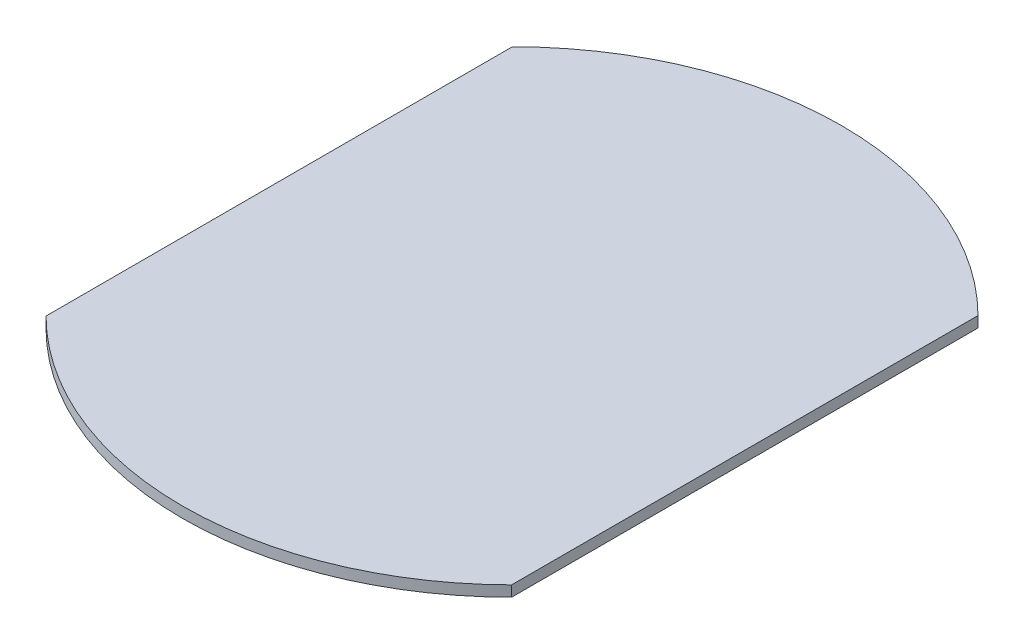
ISO-10303-21;
HEADER;
FILE_DESCRIPTION(('STEP AP214'),'2;1');
FILE_NAME('part.step','',(''),(''),'','','');
FILE_SCHEMA(('AUTOMOTIVE_DESIGN { 1 0 10303 214 1 1 1 1 }'));
ENDSEC;
DATA;
#1=APPLICATION_CONTEXT('core data for automotive mechanical design processes');
#2=APPLICATION_PROTOCOL_DEFINITION('international standard','automotive_design',2000,#1);
#3=PRODUCT_CONTEXT('',#1,'mechanical');
#4=PRODUCT('Part','Part','',(#3));
#5=PRODUCT_RELATED_PRODUCT_CATEGORY('part','',(#4));
#6=PRODUCT_DEFINITION_FORMATION('','',#4);
#7=PRODUCT_DEFINITION_CONTEXT('part definition',#1,'design');
#8=PRODUCT_DEFINITION('design','',#6,#7);
#9=PRODUCT_DEFINITION_SHAPE('','',#8);
#10=(LENGTH_UNIT() NAMED_UNIT(*) SI_UNIT(.MILLI.,.METRE.));
#11=(NAMED_UNIT(*) PLANE_ANGLE_UNIT() SI_UNIT($,.RADIAN.));
#12=(NAMED_UNIT(*) SI_UNIT($,.STERADIAN.) SOLID_ANGLE_UNIT());
#13=UNCERTAINTY_MEASURE_WITH_UNIT(LENGTH_MEASURE(1.E-05),#10,'distance_accuracy_value','');
#14=(GEOMETRIC_REPRESENTATION_CONTEXT(3) GLOBAL_UNCERTAINTY_ASSIGNED_CONTEXT((#13)) GLOBAL_UNIT_ASSIGNED_CONTEXT((#10,
#11,#12)) REPRESENTATION_CONTEXT('',''));
#15=CARTESIAN_POINT('',(0.,0.,0.));
#16=DIRECTION('',(0.,0.,1.));
#17=DIRECTION('',(1.,0.,0.));
#18=AXIS2_PLACEMENT_3D('',#15,#16,#17);
#19=CARTESIAN_POINT('',(0.,0.75,0.));
#20=DIRECTION('',(0.,-1.,0.));
#21=DIRECTION('',(0.,0.,-1.));
#22=AXIS2_PLACEMENT_3D('',#19,#20,#21);
#23=CYLINDRICAL_SURFACE('',#22,46.);
#24=CARTESIAN_POINT('',(0.,-0.75,0.));
#25=DIRECTION('',(0.,1.,0.));
#26=DIRECTION('',(0.,0.,1.));
#27=AXIS2_PLACEMENT_3D('',#24,#25,#26);
#28=CIRCLE('',#27,46.);
#29=CARTESIAN_POINT('',(-32.5,-0.75,32.5538016213161));
#30=VERTEX_POINT('',#29);
#31=CARTESIAN_POINT('',(32.5,-0.75,32.5538016213161));
#32=VERTEX_POINT('',#31);
#33=EDGE_CURVE('E102',#30,#32,#28,.T.);
#34=ORIENTED_EDGE('',*,*,#33,.T.);
#35=DIRECTION('',(0.,-1.,0.));
#36=VECTOR('',#35,1.);
#37=CARTESIAN_POINT('',(32.5,0.75,32.5538016213161));
#38=LINE('',#37,#36);
#39=CARTESIAN_POINT('',(32.5,0.75,32.5538016213161));
#40=VERTEX_POINT('',#39);
#41=EDGE_CURVE('E11',#40,#32,#38,.T.);
#42=ORIENTED_EDGE('',*,*,#41,.F.);
#43=CARTESIAN_POINT('',(0.,0.75,0.));
#44=DIRECTION('',(0.,1.,0.));
#45=DIRECTION('',(0.,0.,1.));
#46=AXIS2_PLACEMENT_3D('',#43,#44,#45);
#47=CIRCLE('',#46,46.);
#48=CARTESIAN_POINT('',(-32.5,0.75,32.5538016213161));
#49=VERTEX_POINT('',#48);
#50=EDGE_CURVE('E90',#49,#40,#47,.T.);
#51=ORIENTED_EDGE('',*,*,#50,.F.);
#52=DIRECTION('',(0.,-1.,0.));
#53=VECTOR('',#52,1.);
#54=CARTESIAN_POINT('',(-32.5,0.75,32.5538016213161));
#55=LINE('',#54,#53);
#56=EDGE_CURVE('E98',#49,#30,#55,.T.);
#57=ORIENTED_EDGE('',*,*,#56,.T.);
#58=EDGE_LOOP('',(#34,#42,#51,#57));
#59=FACE_BOUND('',#58,.T.);
#60=ADVANCED_FACE('F39',(#59),#23,.T.);
#61=CARTESIAN_POINT('',(32.5,0.75,32.5538016213161));
#62=DIRECTION('',(-1.,0.,0.));
#63=DIRECTION('',(0.,0.,1.));
#64=AXIS2_PLACEMENT_3D('',#61,#62,#63);
#65=PLANE('',#64);
#66=DIRECTION('',(0.,0.,-1.));
#67=VECTOR('',#66,1.);
#68=CARTESIAN_POINT('',(32.5,-0.75,32.5538016213161));
#69=LINE('',#68,#67);
#70=CARTESIAN_POINT('',(32.5,-0.75,-32.5538016213161));
#71=VERTEX_POINT('',#70);
#72=EDGE_CURVE('E94',#32,#71,#69,.T.);
#73=ORIENTED_EDGE('',*,*,#72,.T.);
#74=DIRECTION('',(0.,-1.,0.));
#75=VECTOR('',#74,1.);
#76=CARTESIAN_POINT('',(32.5,0.75,-32.5538016213161));
#77=LINE('',#76,#75);
#78=CARTESIAN_POINT('',(32.5,0.75,-32.5538016213161));
#79=VERTEX_POINT('',#78);
#80=EDGE_CURVE('E47',#79,#71,#77,.T.);
#81=ORIENTED_EDGE('',*,*,#80,.F.);
#82=DIRECTION('',(0.,0.,-1.));
#83=VECTOR('',#82,1.);
#84=CARTESIAN_POINT('',(32.5,0.75,32.5538016213161));
#85=LINE('',#84,#83);
#86=EDGE_CURVE('E85',#40,#79,#85,.T.);
#87=ORIENTED_EDGE('',*,*,#86,.F.);
#88=ORIENTED_EDGE('',*,*,#41,.T.);
#89=EDGE_LOOP('',(#73,#81,#87,#88));
#90=FACE_BOUND('',#89,.T.);
#91=ADVANCED_FACE('F93',(#90),#65,.F.);
#92=CARTESIAN_POINT('',(0.,0.75,0.));
#93=DIRECTION('',(0.,-1.,0.));
#94=DIRECTION('',(0.,0.,-1.));
#95=AXIS2_PLACEMENT_3D('',#92,#93,#94);
#96=CYLINDRICAL_SURFACE('',#95,46.);
#97=CARTESIAN_POINT('',(0.,-0.75,0.));
#98=DIRECTION('',(0.,1.,0.));
#99=DIRECTION('',(0.,0.,-1.));
#100=AXIS2_PLACEMENT_3D('',#97,#98,#99);
#101=CIRCLE('',#100,46.);
#102=CARTESIAN_POINT('',(-32.5,-0.75,-32.5538016213161));
#103=VERTEX_POINT('',#102);
#104=EDGE_CURVE('E72',#71,#103,#101,.T.);
#105=ORIENTED_EDGE('',*,*,#104,.T.);
#106=DIRECTION('',(0.,-1.,0.));
#107=VECTOR('',#106,1.);
#108=CARTESIAN_POINT('',(-32.5,0.75,-32.5538016213161));
#109=LINE('',#108,#107);
#110=CARTESIAN_POINT('',(-32.5,0.75,-32.5538016213161));
#111=VERTEX_POINT('',#110);
#112=EDGE_CURVE('E95',#111,#103,#109,.T.);
#113=ORIENTED_EDGE('',*,*,#112,.F.);
#114=CARTESIAN_POINT('',(0.,0.75,0.));
#115=DIRECTION('',(0.,1.,0.));
#116=DIRECTION('',(0.,0.,-1.));
#117=AXIS2_PLACEMENT_3D('',#114,#115,#116);
#118=CIRCLE('',#117,46.);
#119=EDGE_CURVE('E88',#79,#111,#118,.T.);
#120=ORIENTED_EDGE('',*,*,#119,.F.);
#121=ORIENTED_EDGE('',*,*,#80,.T.);
#122=EDGE_LOOP('',(#105,#113,#120,#121));
#123=FACE_BOUND('',#122,.T.);
#124=ADVANCED_FACE('F96',(#123),#96,.T.);
#125=CARTESIAN_POINT('',(-32.5,0.75,32.5538016213161));
#126=DIRECTION('',(1.,0.,0.));
#127=DIRECTION('',(0.,0.,-1.));
#128=AXIS2_PLACEMENT_3D('',#125,#126,#127);
#129=PLANE('',#128);
#130=DIRECTION('',(0.,0.,1.));
#131=VECTOR('',#130,1.);
#132=CARTESIAN_POINT('',(-32.5,-0.75,32.5538016213161));
#133=LINE('',#132,#131);
#134=EDGE_CURVE('E78',#103,#30,#133,.T.);
#135=ORIENTED_EDGE('',*,*,#134,.T.);
#136=ORIENTED_EDGE('',*,*,#56,.F.);
#137=DIRECTION('',(0.,0.,1.));
#138=VECTOR('',#137,1.);
#139=CARTESIAN_POINT('',(-32.5,0.75,32.5538016213161));
#140=LINE('',#139,#138);
#141=EDGE_CURVE('E55',#111,#49,#140,.T.);
#142=ORIENTED_EDGE('',*,*,#141,.F.);
#143=ORIENTED_EDGE('',*,*,#112,.T.);
#144=EDGE_LOOP('',(#135,#136,#142,#143));
#145=FACE_BOUND('',#144,.T.);
#146=ADVANCED_FACE('F109',(#145),#129,.F.);
#147=CARTESIAN_POINT('',(0.,0.75,0.));
#148=DIRECTION('',(0.,1.,0.));
#149=DIRECTION('',(0.,0.,1.));
#150=AXIS2_PLACEMENT_3D('',#147,#148,#149);
#151=PLANE('',#150);
#152=ORIENTED_EDGE('',*,*,#50,.T.);
#153=ORIENTED_EDGE('',*,*,#86,.T.);
#154=ORIENTED_EDGE('',*,*,#119,.T.);
#155=ORIENTED_EDGE('',*,*,#141,.T.);
#156=EDGE_LOOP('',(#152,#153,#154,#155));
#157=FACE_BOUND('',#156,.T.);
#158=ADVANCED_FACE('F86',(#157),#151,.T.);
#159=CARTESIAN_POINT('',(0.,-0.75,0.));
#160=DIRECTION('',(0.,1.,0.));
#161=DIRECTION('',(0.,0.,1.));
#162=AXIS2_PLACEMENT_3D('',#159,#160,#161);
#163=PLANE('',#162);
#164=ORIENTED_EDGE('',*,*,#33,.F.);
#165=ORIENTED_EDGE('',*,*,#134,.F.);
#166=ORIENTED_EDGE('',*,*,#104,.F.);
#167=ORIENTED_EDGE('',*,*,#72,.F.);
#168=EDGE_LOOP('',(#164,#165,#166,#167));
#169=FACE_BOUND('',#168,.T.);
#170=ADVANCED_FACE('F112',(#169),#163,.F.);
#171=CLOSED_SHELL('',(#60,#91,#124,#146,#158,#170));
#172=MANIFOLD_SOLID_BREP('B2',#171);
#173=ADVANCED_BREP_SHAPE_REPRESENTATION('',(#18,#172),#14);
#174=SHAPE_DEFINITION_REPRESENTATION(#9,#173);
ENDSEC;
END-ISO-10303-21;
